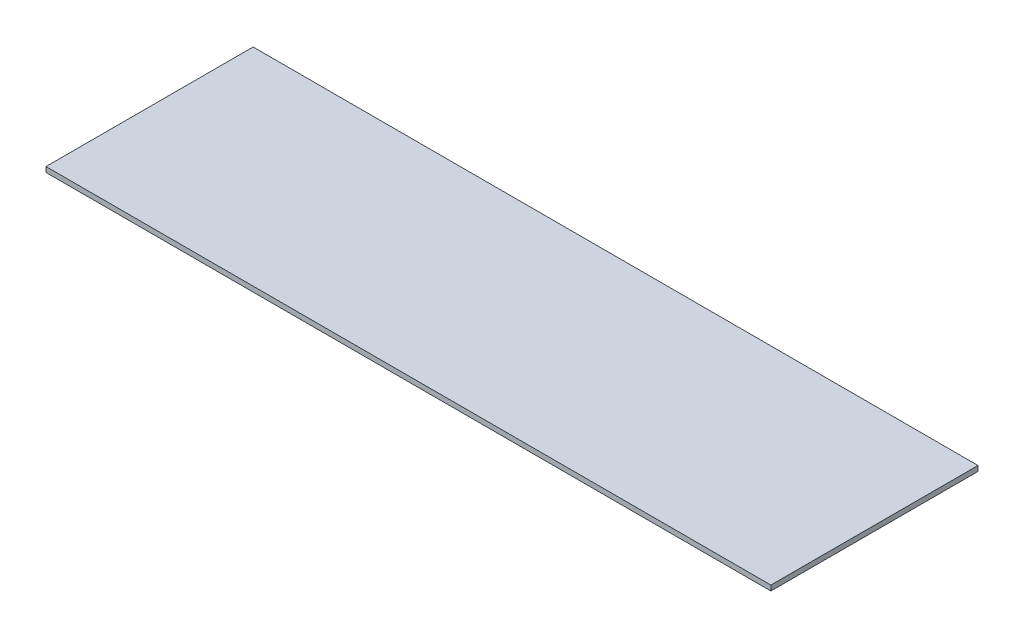
ISO-10303-21;
HEADER;
FILE_DESCRIPTION(('STEP AP214'),'2;1');
FILE_NAME('part.step','',(''),(''),'','','');
FILE_SCHEMA(('AUTOMOTIVE_DESIGN { 1 0 10303 214 1 1 1 1 }'));
ENDSEC;
DATA;
#1=APPLICATION_CONTEXT('core data for automotive mechanical design processes');
#2=APPLICATION_PROTOCOL_DEFINITION('international standard','automotive_design',2000,#1);
#3=PRODUCT_CONTEXT('',#1,'mechanical');
#4=PRODUCT('Part','Part','',(#3));
#5=PRODUCT_RELATED_PRODUCT_CATEGORY('part','',(#4));
#6=PRODUCT_DEFINITION_FORMATION('','',#4);
#7=PRODUCT_DEFINITION_CONTEXT('part definition',#1,'design');
#8=PRODUCT_DEFINITION('design','',#6,#7);
#9=PRODUCT_DEFINITION_SHAPE('','',#8);
#10=(LENGTH_UNIT() NAMED_UNIT(*) SI_UNIT(.MILLI.,.METRE.));
#11=(NAMED_UNIT(*) PLANE_ANGLE_UNIT() SI_UNIT($,.RADIAN.));
#12=(NAMED_UNIT(*) SI_UNIT($,.STERADIAN.) SOLID_ANGLE_UNIT());
#13=UNCERTAINTY_MEASURE_WITH_UNIT(LENGTH_MEASURE(1.E-05),#10,'distance_accuracy_value','');
#14=(GEOMETRIC_REPRESENTATION_CONTEXT(3) GLOBAL_UNCERTAINTY_ASSIGNED_CONTEXT((#13)) GLOBAL_UNIT_ASSIGNED_CONTEXT((#10,
#11,#12)) REPRESENTATION_CONTEXT('',''));
#15=CARTESIAN_POINT('',(0.,0.,0.));
#16=DIRECTION('',(0.,0.,1.));
#17=DIRECTION('',(1.,0.,0.));
#18=AXIS2_PLACEMENT_3D('',#15,#16,#17);
#19=CARTESIAN_POINT('',(0.,1.,20.));
#20=DIRECTION('',(0.,0.,-1.));
#21=DIRECTION('',(-1.,0.,0.));
#22=AXIS2_PLACEMENT_3D('',#19,#20,#21);
#23=PLANE('',#22);
#24=DIRECTION('',(1.,0.,0.));
#25=VECTOR('',#24,1.);
#26=CARTESIAN_POINT('',(0.,0.,20.));
#27=LINE('',#26,#25);
#28=CARTESIAN_POINT('',(-70.,0.,20.));
#29=VERTEX_POINT('',#28);
#30=CARTESIAN_POINT('',(70.,0.,20.));
#31=VERTEX_POINT('',#30);
#32=EDGE_CURVE('E102',#29,#31,#27,.T.);
#33=ORIENTED_EDGE('',*,*,#32,.T.);
#34=DIRECTION('',(0.,-1.,0.));
#35=VECTOR('',#34,1.);
#36=CARTESIAN_POINT('',(70.,1.,20.));
#37=LINE('',#36,#35);
#38=CARTESIAN_POINT('',(70.,1.,20.));
#39=VERTEX_POINT('',#38);
#40=EDGE_CURVE('E11',#39,#31,#37,.T.);
#41=ORIENTED_EDGE('',*,*,#40,.F.);
#42=DIRECTION('',(1.,0.,0.));
#43=VECTOR('',#42,1.);
#44=CARTESIAN_POINT('',(0.,1.,20.));
#45=LINE('',#44,#43);
#46=CARTESIAN_POINT('',(-70.,1.,20.));
#47=VERTEX_POINT('',#46);
#48=EDGE_CURVE('E88',#47,#39,#45,.T.);
#49=ORIENTED_EDGE('',*,*,#48,.F.);
#50=DIRECTION('',(0.,-1.,0.));
#51=VECTOR('',#50,1.);
#52=CARTESIAN_POINT('',(-70.,1.,20.));
#53=LINE('',#52,#51);
#54=EDGE_CURVE('E55',#47,#29,#53,.T.);
#55=ORIENTED_EDGE('',*,*,#54,.T.);
#56=EDGE_LOOP('',(#33,#41,#49,#55));
#57=FACE_BOUND('',#56,.T.);
#58=ADVANCED_FACE('F39',(#57),#23,.F.);
#59=CARTESIAN_POINT('',(70.,1.,0.));
#60=DIRECTION('',(-1.,0.,0.));
#61=DIRECTION('',(0.,0.,1.));
#62=AXIS2_PLACEMENT_3D('',#59,#60,#61);
#63=PLANE('',#62);
#64=DIRECTION('',(0.,0.,-1.));
#65=VECTOR('',#64,1.);
#66=CARTESIAN_POINT('',(70.,0.,0.));
#67=LINE('',#66,#65);
#68=CARTESIAN_POINT('',(70.,0.,-20.));
#69=VERTEX_POINT('',#68);
#70=EDGE_CURVE('E93',#31,#69,#67,.T.);
#71=ORIENTED_EDGE('',*,*,#70,.T.);
#72=DIRECTION('',(0.,-1.,0.));
#73=VECTOR('',#72,1.);
#74=CARTESIAN_POINT('',(70.,1.,-20.));
#75=LINE('',#74,#73);
#76=CARTESIAN_POINT('',(70.,1.,-20.));
#77=VERTEX_POINT('',#76);
#78=EDGE_CURVE('E47',#77,#69,#75,.T.);
#79=ORIENTED_EDGE('',*,*,#78,.F.);
#80=DIRECTION('',(0.,0.,-1.));
#81=VECTOR('',#80,1.);
#82=CARTESIAN_POINT('',(70.,1.,0.));
#83=LINE('',#82,#81);
#84=EDGE_CURVE('E80',#39,#77,#83,.T.);
#85=ORIENTED_EDGE('',*,*,#84,.F.);
#86=ORIENTED_EDGE('',*,*,#40,.T.);
#87=EDGE_LOOP('',(#71,#79,#85,#86));
#88=FACE_BOUND('',#87,.T.);
#89=ADVANCED_FACE('F92',(#88),#63,.F.);
#90=CARTESIAN_POINT('',(0.,1.,-20.));
#91=DIRECTION('',(0.,0.,-1.));
#92=DIRECTION('',(-1.,0.,0.));
#93=AXIS2_PLACEMENT_3D('',#90,#91,#92);
#94=PLANE('',#93);
#95=DIRECTION('',(1.,0.,0.));
#96=VECTOR('',#95,1.);
#97=CARTESIAN_POINT('',(0.,0.,-20.));
#98=LINE('',#97,#96);
#99=CARTESIAN_POINT('',(-70.,0.,-20.));
#100=VERTEX_POINT('',#99);
#101=EDGE_CURVE('E105',#100,#69,#98,.T.);
#102=ORIENTED_EDGE('',*,*,#101,.F.);
#103=DIRECTION('',(0.,-1.,0.));
#104=VECTOR('',#103,1.);
#105=CARTESIAN_POINT('',(-70.,1.,-20.));
#106=LINE('',#105,#104);
#107=CARTESIAN_POINT('',(-70.,1.,-20.));
#108=VERTEX_POINT('',#107);
#109=EDGE_CURVE('E69',#108,#100,#106,.T.);
#110=ORIENTED_EDGE('',*,*,#109,.F.);
#111=DIRECTION('',(1.,0.,0.));
#112=VECTOR('',#111,1.);
#113=CARTESIAN_POINT('',(0.,1.,-20.));
#114=LINE('',#113,#112);
#115=EDGE_CURVE('E87',#108,#77,#114,.T.);
#116=ORIENTED_EDGE('',*,*,#115,.T.);
#117=ORIENTED_EDGE('',*,*,#78,.T.);
#118=EDGE_LOOP('',(#102,#110,#116,#117));
#119=FACE_BOUND('',#118,.T.);
#120=ADVANCED_FACE('F96',(#119),#94,.T.);
#121=CARTESIAN_POINT('',(-70.,1.,0.));
#122=DIRECTION('',(-1.,0.,0.));
#123=DIRECTION('',(0.,0.,1.));
#124=AXIS2_PLACEMENT_3D('',#121,#122,#123);
#125=PLANE('',#124);
#126=DIRECTION('',(0.,0.,-1.));
#127=VECTOR('',#126,1.);
#128=CARTESIAN_POINT('',(-70.,0.,0.));
#129=LINE('',#128,#127);
#130=EDGE_CURVE('E107',#29,#100,#129,.T.);
#131=ORIENTED_EDGE('',*,*,#130,.F.);
#132=ORIENTED_EDGE('',*,*,#54,.F.);
#133=DIRECTION('',(0.,0.,-1.));
#134=VECTOR('',#133,1.);
#135=CARTESIAN_POINT('',(-70.,1.,0.));
#136=LINE('',#135,#134);
#137=EDGE_CURVE('E97',#47,#108,#136,.T.);
#138=ORIENTED_EDGE('',*,*,#137,.T.);
#139=ORIENTED_EDGE('',*,*,#109,.T.);
#140=EDGE_LOOP('',(#131,#132,#138,#139));
#141=FACE_BOUND('',#140,.T.);
#142=ADVANCED_FACE('F113',(#141),#125,.T.);
#143=CARTESIAN_POINT('',(0.,1.,0.));
#144=DIRECTION('',(0.,1.,0.));
#145=DIRECTION('',(0.,0.,1.));
#146=AXIS2_PLACEMENT_3D('',#143,#144,#145);
#147=PLANE('',#146);
#148=ORIENTED_EDGE('',*,*,#48,.T.);
#149=ORIENTED_EDGE('',*,*,#84,.T.);
#150=ORIENTED_EDGE('',*,*,#115,.F.);
#151=ORIENTED_EDGE('',*,*,#137,.F.);
#152=EDGE_LOOP('',(#148,#149,#150,#151));
#153=FACE_BOUND('',#152,.T.);
#154=ADVANCED_FACE('F84',(#153),#147,.T.);
#155=CARTESIAN_POINT('',(0.,0.,0.));
#156=DIRECTION('',(0.,1.,0.));
#157=DIRECTION('',(0.,0.,1.));
#158=AXIS2_PLACEMENT_3D('',#155,#156,#157);
#159=PLANE('',#158);
#160=ORIENTED_EDGE('',*,*,#32,.F.);
#161=ORIENTED_EDGE('',*,*,#130,.T.);
#162=ORIENTED_EDGE('',*,*,#101,.T.);
#163=ORIENTED_EDGE('',*,*,#70,.F.);
#164=EDGE_LOOP('',(#160,#161,#162,#163));
#165=FACE_BOUND('',#164,.T.);
#166=ADVANCED_FACE('F112',(#165),#159,.F.);
#167=CLOSED_SHELL('',(#58,#89,#120,#142,#154,#166));
#168=MANIFOLD_SOLID_BREP('B2',#167);
#169=ADVANCED_BREP_SHAPE_REPRESENTATION('',(#18,#168),#14);
#170=SHAPE_DEFINITION_REPRESENTATION(#9,#169);
ENDSEC;
END-ISO-10303-21;
